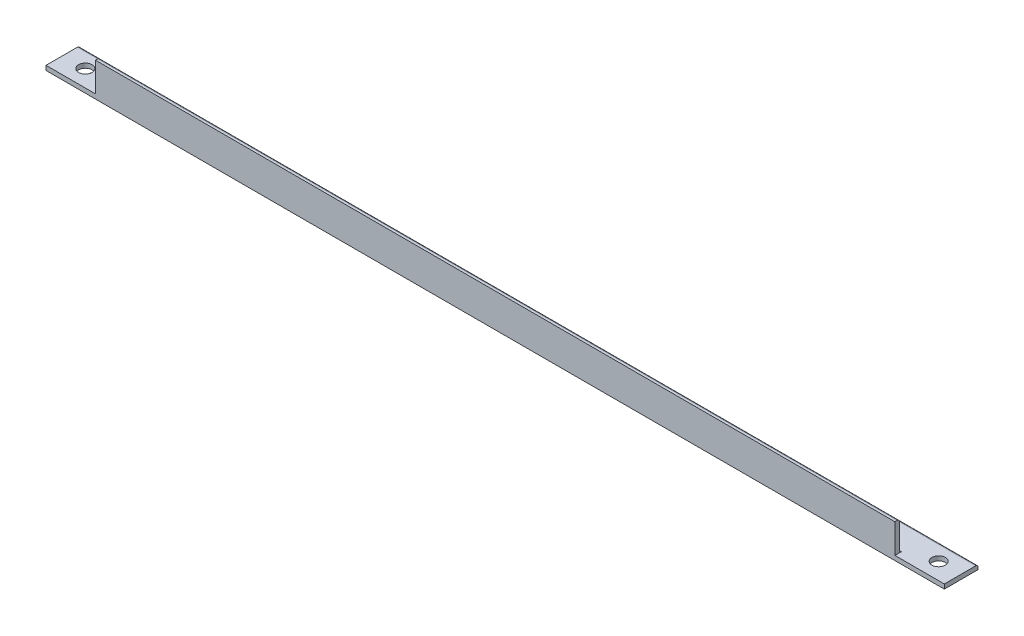
ISO-10303-21;
HEADER;
FILE_DESCRIPTION(('STEP AP214'),'2;1');
FILE_NAME('part.step','',(''),(''),'','','');
FILE_SCHEMA(('AUTOMOTIVE_DESIGN { 1 0 10303 214 1 1 1 1 }'));
ENDSEC;
DATA;
#1=APPLICATION_CONTEXT('core data for automotive mechanical design processes');
#2=APPLICATION_PROTOCOL_DEFINITION('international standard','automotive_design',2000,#1);
#3=PRODUCT_CONTEXT('',#1,'mechanical');
#4=PRODUCT('Part','Part','',(#3));
#5=PRODUCT_RELATED_PRODUCT_CATEGORY('part','',(#4));
#6=PRODUCT_DEFINITION_FORMATION('','',#4);
#7=PRODUCT_DEFINITION_CONTEXT('part definition',#1,'design');
#8=PRODUCT_DEFINITION('design','',#6,#7);
#9=PRODUCT_DEFINITION_SHAPE('','',#8);
#10=(LENGTH_UNIT() NAMED_UNIT(*) SI_UNIT(.MILLI.,.METRE.));
#11=(NAMED_UNIT(*) PLANE_ANGLE_UNIT() SI_UNIT($,.RADIAN.));
#12=(NAMED_UNIT(*) SI_UNIT($,.STERADIAN.) SOLID_ANGLE_UNIT());
#13=UNCERTAINTY_MEASURE_WITH_UNIT(LENGTH_MEASURE(1.E-05),#10,'distance_accuracy_value','');
#14=(GEOMETRIC_REPRESENTATION_CONTEXT(3) GLOBAL_UNCERTAINTY_ASSIGNED_CONTEXT((#13)) GLOBAL_UNIT_ASSIGNED_CONTEXT((#10,
#11,#12)) REPRESENTATION_CONTEXT('',''));
#15=CARTESIAN_POINT('',(0.,0.,0.));
#16=DIRECTION('',(0.,0.,1.));
#17=DIRECTION('',(1.,0.,0.));
#18=AXIS2_PLACEMENT_3D('',#15,#16,#17);
#19=CARTESIAN_POINT('',(400.,0.,0.));
#20=DIRECTION('',(0.,1.,0.));
#21=DIRECTION('',(0.,0.,1.));
#22=AXIS2_PLACEMENT_3D('',#19,#20,#21);
#23=PLANE('',#22);
#24=CARTESIAN_POINT('',(10.,0.,-7.5));
#25=DIRECTION('',(0.,1.,0.));
#26=DIRECTION('',(0.,0.,1.));
#27=AXIS2_PLACEMENT_3D('',#24,#25,#26);
#28=CIRCLE('',#27,3.);
#29=CARTESIAN_POINT('',(10.,0.,-4.5));
#30=VERTEX_POINT('',#29);
#31=EDGE_CURVE('E214',#30,#30,#28,.T.);
#32=ORIENTED_EDGE('',*,*,#31,.T.);
#33=EDGE_LOOP('',(#32));
#34=FACE_BOUND('',#33,.T.);
#35=CARTESIAN_POINT('',(390.,0.,-7.5));
#36=DIRECTION('',(0.,1.,0.));
#37=DIRECTION('',(0.,0.,1.));
#38=AXIS2_PLACEMENT_3D('',#35,#36,#37);
#39=CIRCLE('',#38,2.99999999999999);
#40=CARTESIAN_POINT('',(390.,0.,-4.50000000000001));
#41=VERTEX_POINT('',#40);
#42=EDGE_CURVE('E138',#41,#41,#39,.T.);
#43=ORIENTED_EDGE('',*,*,#42,.T.);
#44=EDGE_LOOP('',(#43));
#45=FACE_BOUND('',#44,.T.);
#46=DIRECTION('',(0.,0.,-1.));
#47=VECTOR('',#46,1.);
#48=CARTESIAN_POINT('',(0.,0.,0.));
#49=LINE('',#48,#47);
#50=CARTESIAN_POINT('',(0.,0.,0.));
#51=VERTEX_POINT('',#50);
#52=CARTESIAN_POINT('',(0.,0.,-15.));
#53=VERTEX_POINT('',#52);
#54=EDGE_CURVE('E143',#51,#53,#49,.T.);
#55=ORIENTED_EDGE('',*,*,#54,.T.);
#56=DIRECTION('',(-1.,0.,0.));
#57=VECTOR('',#56,1.);
#58=CARTESIAN_POINT('',(400.,0.,-15.));
#59=LINE('',#58,#57);
#60=CARTESIAN_POINT('',(400.,0.,-15.));
#61=VERTEX_POINT('',#60);
#62=EDGE_CURVE('E11',#61,#53,#59,.T.);
#63=ORIENTED_EDGE('',*,*,#62,.F.);
#64=DIRECTION('',(0.,0.,-1.));
#65=VECTOR('',#64,1.);
#66=CARTESIAN_POINT('',(400.,0.,0.));
#67=LINE('',#66,#65);
#68=CARTESIAN_POINT('',(400.,0.,0.));
#69=VERTEX_POINT('',#68);
#70=EDGE_CURVE('E144',#69,#61,#67,.T.);
#71=ORIENTED_EDGE('',*,*,#70,.F.);
#72=DIRECTION('',(-1.,0.,0.));
#73=VECTOR('',#72,1.);
#74=CARTESIAN_POINT('',(400.,0.,0.));
#75=LINE('',#74,#73);
#76=EDGE_CURVE('E149',#69,#51,#75,.T.);
#77=ORIENTED_EDGE('',*,*,#76,.T.);
#78=EDGE_LOOP('',(#55,#63,#71,#77));
#79=FACE_BOUND('',#78,.T.);
#80=ADVANCED_FACE('F33',(#34,#45,#79),#23,.F.);
#81=CARTESIAN_POINT('',(400.,0.,-15.));
#82=DIRECTION('',(0.,0.,1.));
#83=DIRECTION('',(1.,0.,0.));
#84=AXIS2_PLACEMENT_3D('',#81,#82,#83);
#85=PLANE('',#84);
#86=DIRECTION('',(0.,1.,0.));
#87=VECTOR('',#86,1.);
#88=CARTESIAN_POINT('',(0.,0.,-15.));
#89=LINE('',#88,#87);
#90=CARTESIAN_POINT('',(0.,0.999999999999993,-15.));
#91=VERTEX_POINT('',#90);
#92=EDGE_CURVE('E170',#53,#91,#89,.T.);
#93=ORIENTED_EDGE('',*,*,#92,.T.);
#94=DIRECTION('',(-1.,0.,0.));
#95=VECTOR('',#94,1.);
#96=CARTESIAN_POINT('',(400.,0.999999999999993,-15.));
#97=LINE('',#96,#95);
#98=CARTESIAN_POINT('',(400.,0.999999999999993,-15.));
#99=VERTEX_POINT('',#98);
#100=EDGE_CURVE('E40',#99,#91,#97,.T.);
#101=ORIENTED_EDGE('',*,*,#100,.F.);
#102=DIRECTION('',(0.,1.,0.));
#103=VECTOR('',#102,1.);
#104=CARTESIAN_POINT('',(400.,0.,-15.));
#105=LINE('',#104,#103);
#106=EDGE_CURVE('E81',#61,#99,#105,.T.);
#107=ORIENTED_EDGE('',*,*,#106,.F.);
#108=ORIENTED_EDGE('',*,*,#62,.T.);
#109=EDGE_LOOP('',(#93,#101,#107,#108));
#110=FACE_BOUND('',#109,.T.);
#111=ADVANCED_FACE('F250',(#110),#85,.F.);
#112=CARTESIAN_POINT('',(400.,1.,-14.));
#113=DIRECTION('',(-1.,0.,0.));
#114=DIRECTION('',(0.,0.,1.));
#115=AXIS2_PLACEMENT_3D('',#112,#113,#114);
#116=CYLINDRICAL_SURFACE('',#115,1.);
#117=CARTESIAN_POINT('',(0.,1.,-14.));
#118=DIRECTION('',(1.,0.,0.));
#119=DIRECTION('',(0.,0.,-1.));
#120=AXIS2_PLACEMENT_3D('',#117,#118,#119);
#121=CIRCLE('',#120,1.);
#122=CARTESIAN_POINT('',(0.,2.,-14.));
#123=VERTEX_POINT('',#122);
#124=EDGE_CURVE('E133',#91,#123,#121,.T.);
#125=ORIENTED_EDGE('',*,*,#124,.T.);
#126=DIRECTION('',(-1.,0.,0.));
#127=VECTOR('',#126,1.);
#128=CARTESIAN_POINT('',(400.,2.,-14.));
#129=LINE('',#128,#127);
#130=CARTESIAN_POINT('',(400.,2.,-14.));
#131=VERTEX_POINT('',#130);
#132=EDGE_CURVE('E129',#131,#123,#129,.T.);
#133=ORIENTED_EDGE('',*,*,#132,.F.);
#134=CARTESIAN_POINT('',(400.,1.,-14.));
#135=DIRECTION('',(1.,0.,0.));
#136=DIRECTION('',(0.,0.,-1.));
#137=AXIS2_PLACEMENT_3D('',#134,#135,#136);
#138=CIRCLE('',#137,1.);
#139=EDGE_CURVE('E169',#99,#131,#138,.T.);
#140=ORIENTED_EDGE('',*,*,#139,.F.);
#141=ORIENTED_EDGE('',*,*,#100,.T.);
#142=EDGE_LOOP('',(#125,#133,#140,#141));
#143=FACE_BOUND('',#142,.T.);
#144=ADVANCED_FACE('F168',(#143),#116,.T.);
#145=CARTESIAN_POINT('',(400.,2.,-14.));
#146=DIRECTION('',(0.,-1.,0.));
#147=DIRECTION('',(0.,0.,-1.));
#148=AXIS2_PLACEMENT_3D('',#145,#146,#147);
#149=PLANE('',#148);
#150=CARTESIAN_POINT('',(10.,2.,-7.5));
#151=DIRECTION('',(0.,1.,0.));
#152=DIRECTION('',(0.,0.,1.));
#153=AXIS2_PLACEMENT_3D('',#150,#151,#152);
#154=CIRCLE('',#153,3.);
#155=CARTESIAN_POINT('',(10.,2.,-4.5));
#156=VERTEX_POINT('',#155);
#157=EDGE_CURVE('E217',#156,#156,#154,.T.);
#158=ORIENTED_EDGE('',*,*,#157,.F.);
#159=EDGE_LOOP('',(#158));
#160=FACE_BOUND('',#159,.T.);
#161=CARTESIAN_POINT('',(390.,2.,-7.5));
#162=DIRECTION('',(0.,1.,0.));
#163=DIRECTION('',(0.,0.,1.));
#164=AXIS2_PLACEMENT_3D('',#161,#162,#163);
#165=CIRCLE('',#164,2.99999999999999);
#166=CARTESIAN_POINT('',(390.,2.,-4.50000000000001));
#167=VERTEX_POINT('',#166);
#168=EDGE_CURVE('E211',#167,#167,#165,.T.);
#169=ORIENTED_EDGE('',*,*,#168,.F.);
#170=EDGE_LOOP('',(#169));
#171=FACE_BOUND('',#170,.T.);
#172=ORIENTED_EDGE('',*,*,#132,.T.);
#173=DIRECTION('',(0.,0.,1.));
#174=VECTOR('',#173,1.);
#175=CARTESIAN_POINT('',(0.,2.,-14.));
#176=LINE('',#175,#174);
#177=CARTESIAN_POINT('',(0.,2.,0.));
#178=VERTEX_POINT('',#177);
#179=EDGE_CURVE('E123',#123,#178,#176,.T.);
#180=ORIENTED_EDGE('',*,*,#179,.T.);
#181=DIRECTION('',(1.,0.,0.));
#182=VECTOR('',#181,1.);
#183=CARTESIAN_POINT('',(0.,2.,0.));
#184=LINE('',#183,#182);
#185=CARTESIAN_POINT('',(22.,2.,0.));
#186=VERTEX_POINT('',#185);
#187=EDGE_CURVE('E126',#178,#186,#184,.T.);
#188=ORIENTED_EDGE('',*,*,#187,.T.);
#189=DIRECTION('',(0.,0.,1.));
#190=VECTOR('',#189,1.);
#191=CARTESIAN_POINT('',(22.,2.,-15.));
#192=LINE('',#191,#190);
#193=CARTESIAN_POINT('',(22.,2.,-3.));
#194=VERTEX_POINT('',#193);
#195=EDGE_CURVE('E206',#194,#186,#192,.T.);
#196=ORIENTED_EDGE('',*,*,#195,.F.);
#197=DIRECTION('',(-1.,0.,0.));
#198=VECTOR('',#197,1.);
#199=CARTESIAN_POINT('',(400.,2.,-3.00000000000001));
#200=LINE('',#199,#198);
#201=CARTESIAN_POINT('',(378.,2.,-3.));
#202=VERTEX_POINT('',#201);
#203=EDGE_CURVE('E162',#202,#194,#200,.T.);
#204=ORIENTED_EDGE('',*,*,#203,.F.);
#205=DIRECTION('',(0.,0.,1.));
#206=VECTOR('',#205,1.);
#207=CARTESIAN_POINT('',(378.,2.,-15.));
#208=LINE('',#207,#206);
#209=CARTESIAN_POINT('',(378.,2.,0.));
#210=VERTEX_POINT('',#209);
#211=EDGE_CURVE('E187',#202,#210,#208,.T.);
#212=ORIENTED_EDGE('',*,*,#211,.T.);
#213=DIRECTION('',(1.,0.,0.));
#214=VECTOR('',#213,1.);
#215=CARTESIAN_POINT('',(400.,2.,0.));
#216=LINE('',#215,#214);
#217=CARTESIAN_POINT('',(400.,2.,0.));
#218=VERTEX_POINT('',#217);
#219=EDGE_CURVE('E190',#210,#218,#216,.T.);
#220=ORIENTED_EDGE('',*,*,#219,.T.);
#221=DIRECTION('',(0.,0.,1.));
#222=VECTOR('',#221,1.);
#223=CARTESIAN_POINT('',(400.,2.,-14.));
#224=LINE('',#223,#222);
#225=EDGE_CURVE('E47',#131,#218,#224,.T.);
#226=ORIENTED_EDGE('',*,*,#225,.F.);
#227=EDGE_LOOP('',(#172,#180,#188,#196,#204,#212,#220,#226));
#228=FACE_BOUND('',#227,.T.);
#229=ADVANCED_FACE('F124',(#160,#171,#228),#149,.F.);
#230=CARTESIAN_POINT('',(400.,3.,-3.));
#231=DIRECTION('',(-1.,0.,0.));
#232=DIRECTION('',(0.,0.,1.));
#233=AXIS2_PLACEMENT_3D('',#230,#231,#232);
#234=CYLINDRICAL_SURFACE('',#233,1.);
#235=ORIENTED_EDGE('',*,*,#203,.T.);
#236=CARTESIAN_POINT('',(22.,3.,-3.));
#237=DIRECTION('',(1.,0.,0.));
#238=DIRECTION('',(0.,0.,-1.));
#239=AXIS2_PLACEMENT_3D('',#236,#237,#238);
#240=CIRCLE('',#239,1.);
#241=CARTESIAN_POINT('',(22.,3.00000000000001,-2.));
#242=VERTEX_POINT('',#241);
#243=EDGE_CURVE('E196',#194,#242,#240,.F.);
#244=ORIENTED_EDGE('',*,*,#243,.T.);
#245=DIRECTION('',(-1.,0.,0.));
#246=VECTOR('',#245,1.);
#247=CARTESIAN_POINT('',(400.,3.00000000000001,-2.));
#248=LINE('',#247,#246);
#249=CARTESIAN_POINT('',(378.,3.00000000000001,-2.));
#250=VERTEX_POINT('',#249);
#251=EDGE_CURVE('E159',#250,#242,#248,.T.);
#252=ORIENTED_EDGE('',*,*,#251,.F.);
#253=CARTESIAN_POINT('',(378.,3.,-3.));
#254=DIRECTION('',(-1.,0.,0.));
#255=DIRECTION('',(0.,0.,1.));
#256=AXIS2_PLACEMENT_3D('',#253,#254,#255);
#257=CIRCLE('',#256,1.);
#258=EDGE_CURVE('E174',#250,#202,#257,.F.);
#259=ORIENTED_EDGE('',*,*,#258,.T.);
#260=EDGE_LOOP('',(#235,#244,#252,#259));
#261=FACE_BOUND('',#260,.T.);
#262=ADVANCED_FACE('F234',(#261),#234,.F.);
#263=CARTESIAN_POINT('',(400.,3.00000000000001,-2.));
#264=DIRECTION('',(0.,0.,1.));
#265=DIRECTION('',(1.,0.,0.));
#266=AXIS2_PLACEMENT_3D('',#263,#264,#265);
#267=PLANE('',#266);
#268=ORIENTED_EDGE('',*,*,#251,.T.);
#269=DIRECTION('',(0.,1.,0.));
#270=VECTOR('',#269,1.);
#271=CARTESIAN_POINT('',(22.,3.00000000000001,-2.));
#272=LINE('',#271,#270);
#273=CARTESIAN_POINT('',(22.,14.,-2.));
#274=VERTEX_POINT('',#273);
#275=EDGE_CURVE('E199',#242,#274,#272,.T.);
#276=ORIENTED_EDGE('',*,*,#275,.T.);
#277=DIRECTION('',(-1.,0.,0.));
#278=VECTOR('',#277,1.);
#279=CARTESIAN_POINT('',(400.,14.,-2.));
#280=LINE('',#279,#278);
#281=CARTESIAN_POINT('',(378.,14.,-2.));
#282=VERTEX_POINT('',#281);
#283=EDGE_CURVE('E156',#282,#274,#280,.T.);
#284=ORIENTED_EDGE('',*,*,#283,.F.);
#285=DIRECTION('',(0.,-1.,0.));
#286=VECTOR('',#285,1.);
#287=CARTESIAN_POINT('',(378.,3.00000000000001,-2.));
#288=LINE('',#287,#286);
#289=EDGE_CURVE('E181',#282,#250,#288,.T.);
#290=ORIENTED_EDGE('',*,*,#289,.T.);
#291=EDGE_LOOP('',(#268,#276,#284,#290));
#292=FACE_BOUND('',#291,.T.);
#293=ADVANCED_FACE('F261',(#292),#267,.F.);
#294=CARTESIAN_POINT('',(400.,14.,-1.));
#295=DIRECTION('',(-1.,0.,0.));
#296=DIRECTION('',(0.,0.,1.));
#297=AXIS2_PLACEMENT_3D('',#294,#295,#296);
#298=CYLINDRICAL_SURFACE('',#297,1.);
#299=ORIENTED_EDGE('',*,*,#283,.T.);
#300=CARTESIAN_POINT('',(22.,14.,-1.));
#301=DIRECTION('',(1.,0.,0.));
#302=DIRECTION('',(0.,0.,-1.));
#303=AXIS2_PLACEMENT_3D('',#300,#301,#302);
#304=CIRCLE('',#303,1.);
#305=CARTESIAN_POINT('',(22.,15.,-0.999999999999992));
#306=VERTEX_POINT('',#305);
#307=EDGE_CURVE('E202',#274,#306,#304,.T.);
#308=ORIENTED_EDGE('',*,*,#307,.T.);
#309=DIRECTION('',(-1.,0.,0.));
#310=VECTOR('',#309,1.);
#311=CARTESIAN_POINT('',(400.,15.,-0.999999999999993));
#312=LINE('',#311,#310);
#313=CARTESIAN_POINT('',(378.,15.,-0.999999999999992));
#314=VERTEX_POINT('',#313);
#315=EDGE_CURVE('E153',#314,#306,#312,.T.);
#316=ORIENTED_EDGE('',*,*,#315,.F.);
#317=CARTESIAN_POINT('',(378.,14.,-1.));
#318=DIRECTION('',(-1.,0.,0.));
#319=DIRECTION('',(0.,0.,1.));
#320=AXIS2_PLACEMENT_3D('',#317,#318,#319);
#321=CIRCLE('',#320,1.);
#322=EDGE_CURVE('E184',#314,#282,#321,.T.);
#323=ORIENTED_EDGE('',*,*,#322,.T.);
#324=EDGE_LOOP('',(#299,#308,#316,#323));
#325=FACE_BOUND('',#324,.T.);
#326=ADVANCED_FACE('F265',(#325),#298,.T.);
#327=CARTESIAN_POINT('',(400.,15.,-0.999999999999993));
#328=DIRECTION('',(0.,-1.,0.));
#329=DIRECTION('',(0.,0.,-1.));
#330=AXIS2_PLACEMENT_3D('',#327,#328,#329);
#331=PLANE('',#330);
#332=ORIENTED_EDGE('',*,*,#315,.T.);
#333=DIRECTION('',(0.,0.,1.));
#334=VECTOR('',#333,1.);
#335=CARTESIAN_POINT('',(22.,15.,-15.));
#336=LINE('',#335,#334);
#337=CARTESIAN_POINT('',(22.,15.,0.));
#338=VERTEX_POINT('',#337);
#339=EDGE_CURVE('E205',#306,#338,#336,.T.);
#340=ORIENTED_EDGE('',*,*,#339,.T.);
#341=DIRECTION('',(-1.,0.,0.));
#342=VECTOR('',#341,1.);
#343=CARTESIAN_POINT('',(400.,15.,0.));
#344=LINE('',#343,#342);
#345=CARTESIAN_POINT('',(378.,15.,0.));
#346=VERTEX_POINT('',#345);
#347=EDGE_CURVE('E151',#346,#338,#344,.T.);
#348=ORIENTED_EDGE('',*,*,#347,.F.);
#349=DIRECTION('',(0.,0.,1.));
#350=VECTOR('',#349,1.);
#351=CARTESIAN_POINT('',(378.,15.,-15.));
#352=LINE('',#351,#350);
#353=EDGE_CURVE('E188',#314,#346,#352,.T.);
#354=ORIENTED_EDGE('',*,*,#353,.F.);
#355=EDGE_LOOP('',(#332,#340,#348,#354));
#356=FACE_BOUND('',#355,.T.);
#357=ADVANCED_FACE('F269',(#356),#331,.F.);
#358=CARTESIAN_POINT('',(400.,0.,0.));
#359=DIRECTION('',(0.,0.,-1.));
#360=DIRECTION('',(-1.,0.,0.));
#361=AXIS2_PLACEMENT_3D('',#358,#359,#360);
#362=PLANE('',#361);
#363=ORIENTED_EDGE('',*,*,#347,.T.);
#364=DIRECTION('',(0.,1.,0.));
#365=VECTOR('',#364,1.);
#366=CARTESIAN_POINT('',(22.,15.,0.));
#367=LINE('',#366,#365);
#368=EDGE_CURVE('E137',#186,#338,#367,.T.);
#369=ORIENTED_EDGE('',*,*,#368,.F.);
#370=ORIENTED_EDGE('',*,*,#187,.F.);
#371=DIRECTION('',(0.,-1.,0.));
#372=VECTOR('',#371,1.);
#373=CARTESIAN_POINT('',(0.,0.,0.));
#374=LINE('',#373,#372);
#375=EDGE_CURVE('E74',#178,#51,#374,.T.);
#376=ORIENTED_EDGE('',*,*,#375,.T.);
#377=ORIENTED_EDGE('',*,*,#76,.F.);
#378=DIRECTION('',(0.,-1.,0.));
#379=VECTOR('',#378,1.);
#380=CARTESIAN_POINT('',(400.,0.,0.));
#381=LINE('',#380,#379);
#382=EDGE_CURVE('E53',#218,#69,#381,.T.);
#383=ORIENTED_EDGE('',*,*,#382,.F.);
#384=ORIENTED_EDGE('',*,*,#219,.F.);
#385=DIRECTION('',(0.,-1.,0.));
#386=VECTOR('',#385,1.);
#387=CARTESIAN_POINT('',(378.,15.,0.));
#388=LINE('',#387,#386);
#389=EDGE_CURVE('E193',#346,#210,#388,.T.);
#390=ORIENTED_EDGE('',*,*,#389,.F.);
#391=EDGE_LOOP('',(#363,#369,#370,#376,#377,#383,#384,#390));
#392=FACE_BOUND('',#391,.T.);
#393=ADVANCED_FACE('F136',(#392),#362,.F.);
#394=CARTESIAN_POINT('',(400.,1.,-14.));
#395=DIRECTION('',(1.,0.,0.));
#396=DIRECTION('',(0.,0.,-1.));
#397=AXIS2_PLACEMENT_3D('',#394,#395,#396);
#398=PLANE('',#397);
#399=ORIENTED_EDGE('',*,*,#225,.T.);
#400=ORIENTED_EDGE('',*,*,#382,.T.);
#401=ORIENTED_EDGE('',*,*,#70,.T.);
#402=ORIENTED_EDGE('',*,*,#106,.T.);
#403=ORIENTED_EDGE('',*,*,#139,.T.);
#404=EDGE_LOOP('',(#399,#400,#401,#402,#403));
#405=FACE_BOUND('',#404,.T.);
#406=ADVANCED_FACE('F276',(#405),#398,.T.);
#407=CARTESIAN_POINT('',(0.,1.,-14.));
#408=DIRECTION('',(1.,0.,0.));
#409=DIRECTION('',(0.,0.,-1.));
#410=AXIS2_PLACEMENT_3D('',#407,#408,#409);
#411=PLANE('',#410);
#412=ORIENTED_EDGE('',*,*,#375,.F.);
#413=ORIENTED_EDGE('',*,*,#179,.F.);
#414=ORIENTED_EDGE('',*,*,#124,.F.);
#415=ORIENTED_EDGE('',*,*,#92,.F.);
#416=ORIENTED_EDGE('',*,*,#54,.F.);
#417=EDGE_LOOP('',(#412,#413,#414,#415,#416));
#418=FACE_BOUND('',#417,.T.);
#419=ADVANCED_FACE('F141',(#418),#411,.F.);
#420=CARTESIAN_POINT('',(378.,15.,-15.));
#421=DIRECTION('',(-1.,0.,0.));
#422=DIRECTION('',(0.,0.,1.));
#423=AXIS2_PLACEMENT_3D('',#420,#421,#422);
#424=PLANE('',#423);
#425=ORIENTED_EDGE('',*,*,#289,.F.);
#426=ORIENTED_EDGE('',*,*,#322,.F.);
#427=ORIENTED_EDGE('',*,*,#353,.T.);
#428=ORIENTED_EDGE('',*,*,#389,.T.);
#429=ORIENTED_EDGE('',*,*,#211,.F.);
#430=ORIENTED_EDGE('',*,*,#258,.F.);
#431=EDGE_LOOP('',(#425,#426,#427,#428,#429,#430));
#432=FACE_BOUND('',#431,.T.);
#433=ADVANCED_FACE('F245',(#432),#424,.F.);
#434=CARTESIAN_POINT('',(22.,15.,-15.));
#435=DIRECTION('',(1.,0.,0.));
#436=DIRECTION('',(0.,0.,-1.));
#437=AXIS2_PLACEMENT_3D('',#434,#435,#436);
#438=PLANE('',#437);
#439=ORIENTED_EDGE('',*,*,#195,.T.);
#440=ORIENTED_EDGE('',*,*,#368,.T.);
#441=ORIENTED_EDGE('',*,*,#339,.F.);
#442=ORIENTED_EDGE('',*,*,#307,.F.);
#443=ORIENTED_EDGE('',*,*,#275,.F.);
#444=ORIENTED_EDGE('',*,*,#243,.F.);
#445=EDGE_LOOP('',(#439,#440,#441,#442,#443,#444));
#446=FACE_BOUND('',#445,.T.);
#447=ADVANCED_FACE('F239',(#446),#438,.F.);
#448=CARTESIAN_POINT('',(390.,0.,-7.5));
#449=DIRECTION('',(0.,1.,0.));
#450=DIRECTION('',(0.,0.,1.));
#451=AXIS2_PLACEMENT_3D('',#448,#449,#450);
#452=CYLINDRICAL_SURFACE('',#451,2.99999999999999);
#453=ORIENTED_EDGE('',*,*,#42,.F.);
#454=EDGE_LOOP('',(#453));
#455=FACE_BOUND('',#454,.T.);
#456=ORIENTED_EDGE('',*,*,#168,.T.);
#457=EDGE_LOOP('',(#456));
#458=FACE_BOUND('',#457,.T.);
#459=ADVANCED_FACE('F228',(#455,#458),#452,.F.);
#460=CARTESIAN_POINT('',(10.,0.,-7.5));
#461=DIRECTION('',(0.,1.,0.));
#462=DIRECTION('',(0.,0.,1.));
#463=AXIS2_PLACEMENT_3D('',#460,#461,#462);
#464=CYLINDRICAL_SURFACE('',#463,3.);
#465=ORIENTED_EDGE('',*,*,#31,.F.);
#466=EDGE_LOOP('',(#465));
#467=FACE_BOUND('',#466,.T.);
#468=ORIENTED_EDGE('',*,*,#157,.T.);
#469=EDGE_LOOP('',(#468));
#470=FACE_BOUND('',#469,.T.);
#471=ADVANCED_FACE('F225',(#467,#470),#464,.F.);
#472=CLOSED_SHELL('',(#80,#111,#144,#229,#262,#293,#326,#357,#393,#406,#419,#433,#447,#459,#471));
#473=MANIFOLD_SOLID_BREP('B2',#472);
#474=ADVANCED_BREP_SHAPE_REPRESENTATION('',(#18,#473),#14);
#475=SHAPE_DEFINITION_REPRESENTATION(#9,#474);
ENDSEC;
END-ISO-10303-21;
